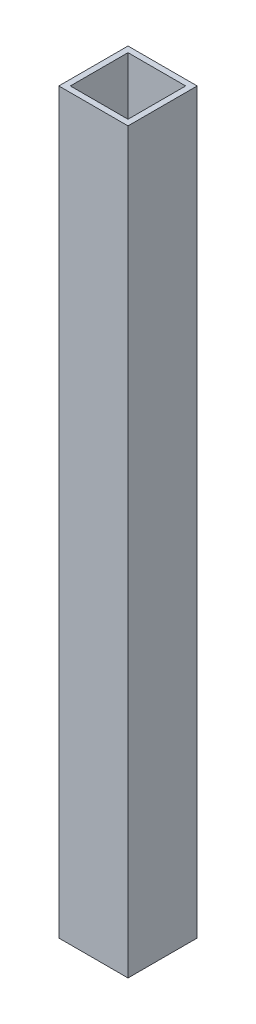
ISO-10303-21;
HEADER;
FILE_DESCRIPTION(('STEP AP214'),'2;1');
FILE_NAME('part.step','',(''),(''),'','','');
FILE_SCHEMA(('AUTOMOTIVE_DESIGN { 1 0 10303 214 1 1 1 1 }'));
ENDSEC;
DATA;
#1=APPLICATION_CONTEXT('core data for automotive mechanical design processes');
#2=APPLICATION_PROTOCOL_DEFINITION('international standard','automotive_design',2000,#1);
#3=PRODUCT_CONTEXT('',#1,'mechanical');
#4=PRODUCT('Part','Part','',(#3));
#5=PRODUCT_RELATED_PRODUCT_CATEGORY('part','',(#4));
#6=PRODUCT_DEFINITION_FORMATION('','',#4);
#7=PRODUCT_DEFINITION_CONTEXT('part definition',#1,'design');
#8=PRODUCT_DEFINITION('design','',#6,#7);
#9=PRODUCT_DEFINITION_SHAPE('','',#8);
#10=(LENGTH_UNIT() NAMED_UNIT(*) SI_UNIT(.MILLI.,.METRE.));
#11=(NAMED_UNIT(*) PLANE_ANGLE_UNIT() SI_UNIT($,.RADIAN.));
#12=(NAMED_UNIT(*) SI_UNIT($,.STERADIAN.) SOLID_ANGLE_UNIT());
#13=UNCERTAINTY_MEASURE_WITH_UNIT(LENGTH_MEASURE(1.E-05),#10,'distance_accuracy_value','');
#14=(GEOMETRIC_REPRESENTATION_CONTEXT(3) GLOBAL_UNCERTAINTY_ASSIGNED_CONTEXT((#13)) GLOBAL_UNIT_ASSIGNED_CONTEXT((#10,
#11,#12)) REPRESENTATION_CONTEXT('',''));
#15=CARTESIAN_POINT('',(0.,0.,0.));
#16=DIRECTION('',(0.,0.,1.));
#17=DIRECTION('',(1.,0.,0.));
#18=AXIS2_PLACEMENT_3D('',#15,#16,#17);
#19=CARTESIAN_POINT('',(0.,203.2,0.));
#20=DIRECTION('',(0.,-1.,0.));
#21=DIRECTION('',(0.,0.,-1.));
#22=AXIS2_PLACEMENT_3D('',#19,#20,#21);
#23=PLANE('',#22);
#24=DIRECTION('',(0.,0.,1.));
#25=VECTOR('',#24,1.);
#26=CARTESIAN_POINT('',(0.,203.2,0.));
#27=LINE('',#26,#25);
#28=CARTESIAN_POINT('',(0.,203.2,-19.05));
#29=VERTEX_POINT('',#28);
#30=CARTESIAN_POINT('',(0.,203.2,0.));
#31=VERTEX_POINT('',#30);
#32=EDGE_CURVE('E134',#29,#31,#27,.T.);
#33=ORIENTED_EDGE('',*,*,#32,.T.);
#34=DIRECTION('',(1.,0.,0.));
#35=VECTOR('',#34,1.);
#36=CARTESIAN_POINT('',(0.,203.2,0.));
#37=LINE('',#36,#35);
#38=CARTESIAN_POINT('',(19.05,203.2,0.));
#39=VERTEX_POINT('',#38);
#40=EDGE_CURVE('E137',#31,#39,#37,.T.);
#41=ORIENTED_EDGE('',*,*,#40,.T.);
#42=DIRECTION('',(0.,0.,-1.));
#43=VECTOR('',#42,1.);
#44=CARTESIAN_POINT('',(19.05,203.2,0.));
#45=LINE('',#44,#43);
#46=CARTESIAN_POINT('',(19.05,203.2,-19.05));
#47=VERTEX_POINT('',#46);
#48=EDGE_CURVE('E140',#39,#47,#45,.T.);
#49=ORIENTED_EDGE('',*,*,#48,.T.);
#50=DIRECTION('',(-1.,0.,0.));
#51=VECTOR('',#50,1.);
#52=CARTESIAN_POINT('',(0.,203.2,-19.05));
#53=LINE('',#52,#51);
#54=EDGE_CURVE('E142',#47,#29,#53,.T.);
#55=ORIENTED_EDGE('',*,*,#54,.T.);
#56=EDGE_LOOP('',(#33,#41,#49,#55));
#57=FACE_BOUND('',#56,.T.);
#58=DIRECTION('',(0.,0.,-1.));
#59=VECTOR('',#58,1.);
#60=CARTESIAN_POINT('',(17.4625,203.2,-1.5875));
#61=LINE('',#60,#59);
#62=CARTESIAN_POINT('',(17.4625,203.2,-1.5875));
#63=VERTEX_POINT('',#62);
#64=CARTESIAN_POINT('',(17.4625,203.2,-17.4625));
#65=VERTEX_POINT('',#64);
#66=EDGE_CURVE('E98',#63,#65,#61,.T.);
#67=ORIENTED_EDGE('',*,*,#66,.F.);
#68=DIRECTION('',(1.,0.,0.));
#69=VECTOR('',#68,1.);
#70=CARTESIAN_POINT('',(1.5875,203.2,-1.5875));
#71=LINE('',#70,#69);
#72=CARTESIAN_POINT('',(1.5875,203.2,-1.5875));
#73=VERTEX_POINT('',#72);
#74=EDGE_CURVE('E120',#73,#63,#71,.T.);
#75=ORIENTED_EDGE('',*,*,#74,.F.);
#76=DIRECTION('',(0.,0.,1.));
#77=VECTOR('',#76,1.);
#78=CARTESIAN_POINT('',(1.5875,203.2,-1.5875));
#79=LINE('',#78,#77);
#80=CARTESIAN_POINT('',(1.5875,203.2,-17.4625));
#81=VERTEX_POINT('',#80);
#82=EDGE_CURVE('E118',#81,#73,#79,.T.);
#83=ORIENTED_EDGE('',*,*,#82,.F.);
#84=DIRECTION('',(-1.,0.,0.));
#85=VECTOR('',#84,1.);
#86=CARTESIAN_POINT('',(1.5875,203.2,-17.4625));
#87=LINE('',#86,#85);
#88=EDGE_CURVE('E106',#65,#81,#87,.T.);
#89=ORIENTED_EDGE('',*,*,#88,.F.);
#90=EDGE_LOOP('',(#67,#75,#83,#89));
#91=FACE_BOUND('',#90,.T.);
#92=ADVANCED_FACE('F33',(#57,#91),#23,.F.);
#93=CARTESIAN_POINT('',(0.,0.,0.));
#94=DIRECTION('',(0.,-1.,0.));
#95=DIRECTION('',(0.,0.,-1.));
#96=AXIS2_PLACEMENT_3D('',#93,#94,#95);
#97=PLANE('',#96);
#98=DIRECTION('',(0.,0.,1.));
#99=VECTOR('',#98,1.);
#100=CARTESIAN_POINT('',(0.,0.,0.));
#101=LINE('',#100,#99);
#102=CARTESIAN_POINT('',(0.,0.,-19.05));
#103=VERTEX_POINT('',#102);
#104=CARTESIAN_POINT('',(0.,0.,0.));
#105=VERTEX_POINT('',#104);
#106=EDGE_CURVE('E114',#103,#105,#101,.T.);
#107=ORIENTED_EDGE('',*,*,#106,.F.);
#108=DIRECTION('',(-1.,0.,0.));
#109=VECTOR('',#108,1.);
#110=CARTESIAN_POINT('',(0.,0.,-19.05));
#111=LINE('',#110,#109);
#112=CARTESIAN_POINT('',(19.05,0.,-19.05));
#113=VERTEX_POINT('',#112);
#114=EDGE_CURVE('E138',#113,#103,#111,.T.);
#115=ORIENTED_EDGE('',*,*,#114,.F.);
#116=DIRECTION('',(0.,0.,-1.));
#117=VECTOR('',#116,1.);
#118=CARTESIAN_POINT('',(19.05,0.,0.));
#119=LINE('',#118,#117);
#120=CARTESIAN_POINT('',(19.05,0.,0.));
#121=VERTEX_POINT('',#120);
#122=EDGE_CURVE('E149',#121,#113,#119,.T.);
#123=ORIENTED_EDGE('',*,*,#122,.F.);
#124=DIRECTION('',(1.,0.,0.));
#125=VECTOR('',#124,1.);
#126=CARTESIAN_POINT('',(0.,0.,0.));
#127=LINE('',#126,#125);
#128=EDGE_CURVE('E147',#105,#121,#127,.T.);
#129=ORIENTED_EDGE('',*,*,#128,.F.);
#130=EDGE_LOOP('',(#107,#115,#123,#129));
#131=FACE_BOUND('',#130,.T.);
#132=DIRECTION('',(1.,0.,0.));
#133=VECTOR('',#132,1.);
#134=CARTESIAN_POINT('',(1.5875,0.,-1.5875));
#135=LINE('',#134,#133);
#136=CARTESIAN_POINT('',(1.5875,0.,-1.5875));
#137=VERTEX_POINT('',#136);
#138=CARTESIAN_POINT('',(17.4625,0.,-1.5875));
#139=VERTEX_POINT('',#138);
#140=EDGE_CURVE('E107',#137,#139,#135,.T.);
#141=ORIENTED_EDGE('',*,*,#140,.T.);
#142=DIRECTION('',(0.,0.,-1.));
#143=VECTOR('',#142,1.);
#144=CARTESIAN_POINT('',(17.4625,0.,-1.5875));
#145=LINE('',#144,#143);
#146=CARTESIAN_POINT('',(17.4625,0.,-17.4625));
#147=VERTEX_POINT('',#146);
#148=EDGE_CURVE('E56',#139,#147,#145,.T.);
#149=ORIENTED_EDGE('',*,*,#148,.T.);
#150=DIRECTION('',(-1.,0.,0.));
#151=VECTOR('',#150,1.);
#152=CARTESIAN_POINT('',(1.5875,0.,-17.4625));
#153=LINE('',#152,#151);
#154=CARTESIAN_POINT('',(1.5875,0.,-17.4625));
#155=VERTEX_POINT('',#154);
#156=EDGE_CURVE('E113',#147,#155,#153,.T.);
#157=ORIENTED_EDGE('',*,*,#156,.T.);
#158=DIRECTION('',(0.,0.,1.));
#159=VECTOR('',#158,1.);
#160=CARTESIAN_POINT('',(1.5875,0.,-1.5875));
#161=LINE('',#160,#159);
#162=EDGE_CURVE('E126',#155,#137,#161,.T.);
#163=ORIENTED_EDGE('',*,*,#162,.T.);
#164=EDGE_LOOP('',(#141,#149,#157,#163));
#165=FACE_BOUND('',#164,.T.);
#166=ADVANCED_FACE('F167',(#131,#165),#97,.T.);
#167=CARTESIAN_POINT('',(0.,203.2,0.));
#168=DIRECTION('',(1.,0.,0.));
#169=DIRECTION('',(0.,0.,-1.));
#170=AXIS2_PLACEMENT_3D('',#167,#168,#169);
#171=PLANE('',#170);
#172=ORIENTED_EDGE('',*,*,#106,.T.);
#173=DIRECTION('',(0.,-1.,0.));
#174=VECTOR('',#173,1.);
#175=CARTESIAN_POINT('',(0.,203.2,0.));
#176=LINE('',#175,#174);
#177=EDGE_CURVE('E11',#31,#105,#176,.T.);
#178=ORIENTED_EDGE('',*,*,#177,.F.);
#179=ORIENTED_EDGE('',*,*,#32,.F.);
#180=DIRECTION('',(0.,-1.,0.));
#181=VECTOR('',#180,1.);
#182=CARTESIAN_POINT('',(0.,203.2,-19.05));
#183=LINE('',#182,#181);
#184=EDGE_CURVE('E144',#29,#103,#183,.T.);
#185=ORIENTED_EDGE('',*,*,#184,.T.);
#186=EDGE_LOOP('',(#172,#178,#179,#185));
#187=FACE_BOUND('',#186,.T.);
#188=ADVANCED_FACE('F35',(#187),#171,.F.);
#189=CARTESIAN_POINT('',(0.,203.2,0.));
#190=DIRECTION('',(0.,0.,-1.));
#191=DIRECTION('',(-1.,0.,0.));
#192=AXIS2_PLACEMENT_3D('',#189,#190,#191);
#193=PLANE('',#192);
#194=ORIENTED_EDGE('',*,*,#128,.T.);
#195=DIRECTION('',(0.,-1.,0.));
#196=VECTOR('',#195,1.);
#197=CARTESIAN_POINT('',(19.05,203.2,0.));
#198=LINE('',#197,#196);
#199=EDGE_CURVE('E41',#39,#121,#198,.T.);
#200=ORIENTED_EDGE('',*,*,#199,.F.);
#201=ORIENTED_EDGE('',*,*,#40,.F.);
#202=ORIENTED_EDGE('',*,*,#177,.T.);
#203=EDGE_LOOP('',(#194,#200,#201,#202));
#204=FACE_BOUND('',#203,.T.);
#205=ADVANCED_FACE('F177',(#204),#193,.F.);
#206=CARTESIAN_POINT('',(19.05,203.2,0.));
#207=DIRECTION('',(-1.,0.,0.));
#208=DIRECTION('',(0.,0.,1.));
#209=AXIS2_PLACEMENT_3D('',#206,#207,#208);
#210=PLANE('',#209);
#211=ORIENTED_EDGE('',*,*,#122,.T.);
#212=DIRECTION('',(0.,-1.,0.));
#213=VECTOR('',#212,1.);
#214=CARTESIAN_POINT('',(19.05,203.2,-19.05));
#215=LINE('',#214,#213);
#216=EDGE_CURVE('E154',#47,#113,#215,.T.);
#217=ORIENTED_EDGE('',*,*,#216,.F.);
#218=ORIENTED_EDGE('',*,*,#48,.F.);
#219=ORIENTED_EDGE('',*,*,#199,.T.);
#220=EDGE_LOOP('',(#211,#217,#218,#219));
#221=FACE_BOUND('',#220,.T.);
#222=ADVANCED_FACE('F161',(#221),#210,.F.);
#223=CARTESIAN_POINT('',(0.,203.2,-19.05));
#224=DIRECTION('',(0.,0.,1.));
#225=DIRECTION('',(1.,0.,0.));
#226=AXIS2_PLACEMENT_3D('',#223,#224,#225);
#227=PLANE('',#226);
#228=ORIENTED_EDGE('',*,*,#114,.T.);
#229=ORIENTED_EDGE('',*,*,#184,.F.);
#230=ORIENTED_EDGE('',*,*,#54,.F.);
#231=ORIENTED_EDGE('',*,*,#216,.T.);
#232=EDGE_LOOP('',(#228,#229,#230,#231));
#233=FACE_BOUND('',#232,.T.);
#234=ADVANCED_FACE('F171',(#233),#227,.F.);
#235=CARTESIAN_POINT('',(17.4625,203.2,-1.5875));
#236=DIRECTION('',(-1.,0.,0.));
#237=DIRECTION('',(0.,0.,1.));
#238=AXIS2_PLACEMENT_3D('',#235,#236,#237);
#239=PLANE('',#238);
#240=ORIENTED_EDGE('',*,*,#148,.F.);
#241=DIRECTION('',(0.,-1.,0.));
#242=VECTOR('',#241,1.);
#243=CARTESIAN_POINT('',(17.4625,203.2,-1.5875));
#244=LINE('',#243,#242);
#245=EDGE_CURVE('E102',#63,#139,#244,.T.);
#246=ORIENTED_EDGE('',*,*,#245,.F.);
#247=ORIENTED_EDGE('',*,*,#66,.T.);
#248=DIRECTION('',(0.,-1.,0.));
#249=VECTOR('',#248,1.);
#250=CARTESIAN_POINT('',(17.4625,203.2,-17.4625));
#251=LINE('',#250,#249);
#252=EDGE_CURVE('E101',#65,#147,#251,.T.);
#253=ORIENTED_EDGE('',*,*,#252,.T.);
#254=EDGE_LOOP('',(#240,#246,#247,#253));
#255=FACE_BOUND('',#254,.T.);
#256=ADVANCED_FACE('F100',(#255),#239,.T.);
#257=CARTESIAN_POINT('',(1.5875,203.2,-17.4625));
#258=DIRECTION('',(0.,0.,1.));
#259=DIRECTION('',(1.,0.,0.));
#260=AXIS2_PLACEMENT_3D('',#257,#258,#259);
#261=PLANE('',#260);
#262=ORIENTED_EDGE('',*,*,#156,.F.);
#263=ORIENTED_EDGE('',*,*,#252,.F.);
#264=ORIENTED_EDGE('',*,*,#88,.T.);
#265=DIRECTION('',(0.,-1.,0.));
#266=VECTOR('',#265,1.);
#267=CARTESIAN_POINT('',(1.5875,203.2,-17.4625));
#268=LINE('',#267,#266);
#269=EDGE_CURVE('E115',#81,#155,#268,.T.);
#270=ORIENTED_EDGE('',*,*,#269,.T.);
#271=EDGE_LOOP('',(#262,#263,#264,#270));
#272=FACE_BOUND('',#271,.T.);
#273=ADVANCED_FACE('F110',(#272),#261,.T.);
#274=CARTESIAN_POINT('',(1.5875,203.2,-1.5875));
#275=DIRECTION('',(1.,0.,0.));
#276=DIRECTION('',(0.,0.,-1.));
#277=AXIS2_PLACEMENT_3D('',#274,#275,#276);
#278=PLANE('',#277);
#279=ORIENTED_EDGE('',*,*,#162,.F.);
#280=ORIENTED_EDGE('',*,*,#269,.F.);
#281=ORIENTED_EDGE('',*,*,#82,.T.);
#282=DIRECTION('',(0.,-1.,0.));
#283=VECTOR('',#282,1.);
#284=CARTESIAN_POINT('',(1.5875,203.2,-1.5875));
#285=LINE('',#284,#283);
#286=EDGE_CURVE('E48',#73,#137,#285,.T.);
#287=ORIENTED_EDGE('',*,*,#286,.T.);
#288=EDGE_LOOP('',(#279,#280,#281,#287));
#289=FACE_BOUND('',#288,.T.);
#290=ADVANCED_FACE('F200',(#289),#278,.T.);
#291=CARTESIAN_POINT('',(1.5875,203.2,-1.5875));
#292=DIRECTION('',(0.,0.,-1.));
#293=DIRECTION('',(-1.,0.,0.));
#294=AXIS2_PLACEMENT_3D('',#291,#292,#293);
#295=PLANE('',#294);
#296=ORIENTED_EDGE('',*,*,#140,.F.);
#297=ORIENTED_EDGE('',*,*,#286,.F.);
#298=ORIENTED_EDGE('',*,*,#74,.T.);
#299=ORIENTED_EDGE('',*,*,#245,.T.);
#300=EDGE_LOOP('',(#296,#297,#298,#299));
#301=FACE_BOUND('',#300,.T.);
#302=ADVANCED_FACE('F204',(#301),#295,.T.);
#303=CLOSED_SHELL('',(#92,#166,#188,#205,#222,#234,#256,#273,#290,#302));
#304=MANIFOLD_SOLID_BREP('B2',#303);
#305=ADVANCED_BREP_SHAPE_REPRESENTATION('',(#18,#304),#14);
#306=SHAPE_DEFINITION_REPRESENTATION(#9,#305);
ENDSEC;
END-ISO-10303-21;
